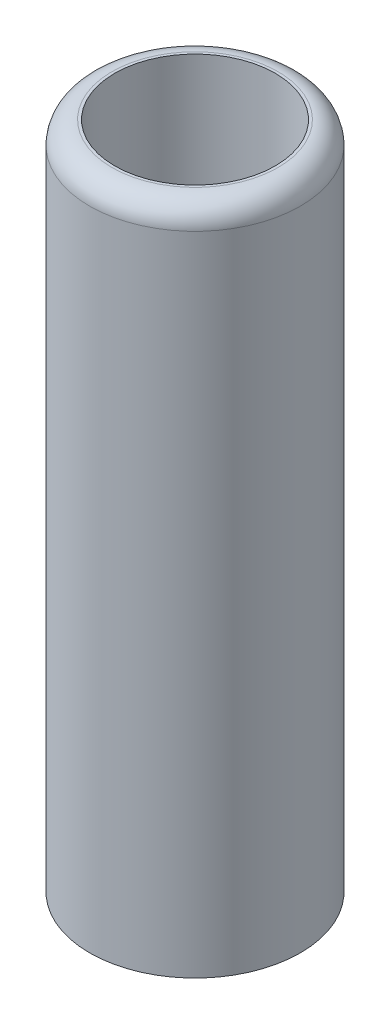
ISO-10303-21;
HEADER;
FILE_DESCRIPTION(('STEP AP214'),'2;1');
FILE_NAME('part.step','',(''),(''),'','','');
FILE_SCHEMA(('AUTOMOTIVE_DESIGN { 1 0 10303 214 1 1 1 1 }'));
ENDSEC;
DATA;
#1=APPLICATION_CONTEXT('core data for automotive mechanical design processes');
#2=APPLICATION_PROTOCOL_DEFINITION('international standard','automotive_design',2000,#1);
#3=PRODUCT_CONTEXT('',#1,'mechanical');
#4=PRODUCT('Part','Part','',(#3));
#5=PRODUCT_RELATED_PRODUCT_CATEGORY('part','',(#4));
#6=PRODUCT_DEFINITION_FORMATION('','',#4);
#7=PRODUCT_DEFINITION_CONTEXT('part definition',#1,'design');
#8=PRODUCT_DEFINITION('design','',#6,#7);
#9=PRODUCT_DEFINITION_SHAPE('','',#8);
#10=(LENGTH_UNIT() NAMED_UNIT(*) SI_UNIT(.MILLI.,.METRE.));
#11=(NAMED_UNIT(*) PLANE_ANGLE_UNIT() SI_UNIT($,.RADIAN.));
#12=(NAMED_UNIT(*) SI_UNIT($,.STERADIAN.) SOLID_ANGLE_UNIT());
#13=UNCERTAINTY_MEASURE_WITH_UNIT(LENGTH_MEASURE(1.E-05),#10,'distance_accuracy_value','');
#14=(GEOMETRIC_REPRESENTATION_CONTEXT(3) GLOBAL_UNCERTAINTY_ASSIGNED_CONTEXT((#13)) GLOBAL_UNIT_ASSIGNED_CONTEXT((#10,
#11,#12)) REPRESENTATION_CONTEXT('',''));
#15=CARTESIAN_POINT('',(0.,0.,0.));
#16=DIRECTION('',(0.,0.,1.));
#17=DIRECTION('',(1.,0.,0.));
#18=AXIS2_PLACEMENT_3D('',#15,#16,#17);
#19=CARTESIAN_POINT('',(0.,60.,0.));
#20=DIRECTION('',(0.,1.,0.));
#21=DIRECTION('',(0.,0.,1.));
#22=AXIS2_PLACEMENT_3D('',#19,#20,#21);
#23=PLANE('',#22);
#24=CARTESIAN_POINT('',(0.,60.,0.));
#25=DIRECTION('',(0.,1.,0.));
#26=DIRECTION('',(0.,0.,1.));
#27=AXIS2_PLACEMENT_3D('',#24,#25,#26);
#28=CIRCLE('',#27,7.45);
#29=CARTESIAN_POINT('',(0.,60.,7.45));
#30=VERTEX_POINT('',#29);
#31=EDGE_CURVE('E39',#30,#30,#28,.T.);
#32=ORIENTED_EDGE('',*,*,#31,.T.);
#33=EDGE_LOOP('',(#32));
#34=FACE_BOUND('',#33,.T.);
#35=CARTESIAN_POINT('',(0.,60.,0.));
#36=DIRECTION('',(0.,1.,0.));
#37=DIRECTION('',(0.,0.,1.));
#38=AXIS2_PLACEMENT_3D('',#35,#36,#37);
#39=CIRCLE('',#38,7.2);
#40=CARTESIAN_POINT('',(0.,60.,7.2));
#41=VERTEX_POINT('',#40);
#42=EDGE_CURVE('E47',#41,#41,#39,.T.);
#43=ORIENTED_EDGE('',*,*,#42,.F.);
#44=EDGE_LOOP('',(#43));
#45=FACE_BOUND('',#44,.T.);
#46=ADVANCED_FACE('F32',(#34,#45),#23,.T.);
#47=CARTESIAN_POINT('',(0.,0.,0.));
#48=DIRECTION('',(0.,1.,0.));
#49=DIRECTION('',(0.,0.,1.));
#50=AXIS2_PLACEMENT_3D('',#47,#48,#49);
#51=PLANE('',#50);
#52=CARTESIAN_POINT('',(0.,0.,0.));
#53=DIRECTION('',(0.,1.,0.));
#54=DIRECTION('',(0.,0.,1.));
#55=AXIS2_PLACEMENT_3D('',#52,#53,#54);
#56=CIRCLE('',#55,9.45);
#57=CARTESIAN_POINT('',(0.,0.,9.45));
#58=VERTEX_POINT('',#57);
#59=EDGE_CURVE('E43',#58,#58,#56,.T.);
#60=ORIENTED_EDGE('',*,*,#59,.F.);
#61=EDGE_LOOP('',(#60));
#62=FACE_BOUND('',#61,.T.);
#63=CARTESIAN_POINT('',(0.,0.,0.));
#64=DIRECTION('',(0.,1.,0.));
#65=DIRECTION('',(0.,0.,1.));
#66=AXIS2_PLACEMENT_3D('',#63,#64,#65);
#67=CIRCLE('',#66,7.2);
#68=CARTESIAN_POINT('',(0.,0.,7.2));
#69=VERTEX_POINT('',#68);
#70=EDGE_CURVE('E50',#69,#69,#67,.T.);
#71=ORIENTED_EDGE('',*,*,#70,.T.);
#72=EDGE_LOOP('',(#71));
#73=FACE_BOUND('',#72,.T.);
#74=ADVANCED_FACE('F60',(#62,#73),#51,.F.);
#75=CARTESIAN_POINT('',(0.,60.,0.));
#76=DIRECTION('',(0.,-1.,0.));
#77=DIRECTION('',(0.,0.,-1.));
#78=AXIS2_PLACEMENT_3D('',#75,#76,#77);
#79=CYLINDRICAL_SURFACE('',#78,9.45);
#80=CARTESIAN_POINT('',(0.,58.,0.));
#81=DIRECTION('',(0.,1.,0.));
#82=DIRECTION('',(0.,0.,1.));
#83=AXIS2_PLACEMENT_3D('',#80,#81,#82);
#84=CIRCLE('',#83,9.45);
#85=CARTESIAN_POINT('',(0.,58.,9.45));
#86=VERTEX_POINT('',#85);
#87=EDGE_CURVE('E10',#86,#86,#84,.F.);
#88=ORIENTED_EDGE('',*,*,#87,.T.);
#89=EDGE_LOOP('',(#88));
#90=FACE_BOUND('',#89,.T.);
#91=ORIENTED_EDGE('',*,*,#59,.T.);
#92=EDGE_LOOP('',(#91));
#93=FACE_BOUND('',#92,.T.);
#94=ADVANCED_FACE('F65',(#90,#93),#79,.T.);
#95=CARTESIAN_POINT('',(0.,60.,0.));
#96=DIRECTION('',(0.,-1.,0.));
#97=DIRECTION('',(0.,0.,-1.));
#98=AXIS2_PLACEMENT_3D('',#95,#96,#97);
#99=CYLINDRICAL_SURFACE('',#98,7.2);
#100=ORIENTED_EDGE('',*,*,#42,.T.);
#101=EDGE_LOOP('',(#100));
#102=FACE_BOUND('',#101,.T.);
#103=ORIENTED_EDGE('',*,*,#70,.F.);
#104=EDGE_LOOP('',(#103));
#105=FACE_BOUND('',#104,.T.);
#106=ADVANCED_FACE('F56',(#102,#105),#99,.F.);
#107=CARTESIAN_POINT('',(0.,58.,0.));
#108=DIRECTION('',(0.,1.,0.));
#109=DIRECTION('',(0.,0.,1.));
#110=AXIS2_PLACEMENT_3D('',#107,#108,#109);
#111=TOROIDAL_SURFACE('',#110,7.45,2.);
#112=ORIENTED_EDGE('',*,*,#87,.F.);
#113=EDGE_LOOP('',(#112));
#114=FACE_BOUND('',#113,.T.);
#115=ORIENTED_EDGE('',*,*,#31,.F.);
#116=EDGE_LOOP('',(#115));
#117=FACE_BOUND('',#116,.T.);
#118=ADVANCED_FACE('F34',(#114,#117),#111,.T.);
#119=CLOSED_SHELL('',(#46,#74,#94,#106,#118));
#120=MANIFOLD_SOLID_BREP('B2',#119);
#121=ADVANCED_BREP_SHAPE_REPRESENTATION('',(#18,#120),#14);
#122=SHAPE_DEFINITION_REPRESENTATION(#9,#121);
ENDSEC;
END-ISO-10303-21;
